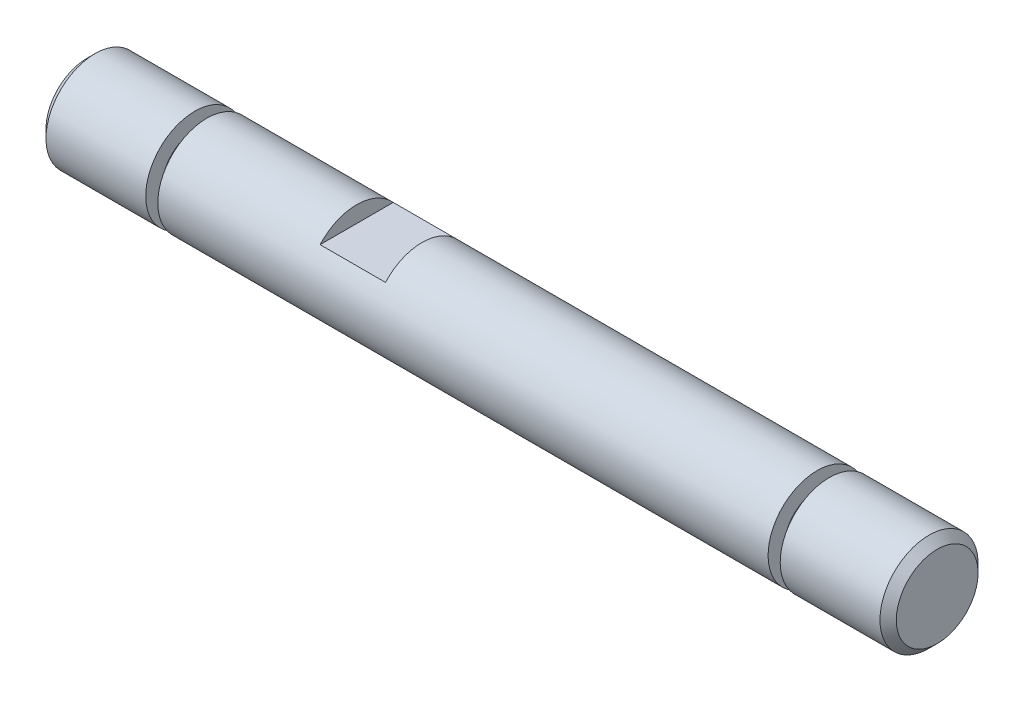
ISO-10303-21;
HEADER;
FILE_DESCRIPTION(('STEP AP214'),'2;1');
FILE_NAME('part.step','',(''),(''),'','','');
FILE_SCHEMA(('AUTOMOTIVE_DESIGN { 1 0 10303 214 1 1 1 1 }'));
ENDSEC;
DATA;
#1=APPLICATION_CONTEXT('core data for automotive mechanical design processes');
#2=APPLICATION_PROTOCOL_DEFINITION('international standard','automotive_design',2000,#1);
#3=PRODUCT_CONTEXT('',#1,'mechanical');
#4=PRODUCT('Part','Part','',(#3));
#5=PRODUCT_RELATED_PRODUCT_CATEGORY('part','',(#4));
#6=PRODUCT_DEFINITION_FORMATION('','',#4);
#7=PRODUCT_DEFINITION_CONTEXT('part definition',#1,'design');
#8=PRODUCT_DEFINITION('design','',#6,#7);
#9=PRODUCT_DEFINITION_SHAPE('','',#8);
#10=(LENGTH_UNIT() NAMED_UNIT(*) SI_UNIT(.MILLI.,.METRE.));
#11=(NAMED_UNIT(*) PLANE_ANGLE_UNIT() SI_UNIT($,.RADIAN.));
#12=(NAMED_UNIT(*) SI_UNIT($,.STERADIAN.) SOLID_ANGLE_UNIT());
#13=UNCERTAINTY_MEASURE_WITH_UNIT(LENGTH_MEASURE(1.E-05),#10,'distance_accuracy_value','');
#14=(GEOMETRIC_REPRESENTATION_CONTEXT(3) GLOBAL_UNCERTAINTY_ASSIGNED_CONTEXT((#13)) GLOBAL_UNIT_ASSIGNED_CONTEXT((#10,
#11,#12)) REPRESENTATION_CONTEXT('',''));
#15=CARTESIAN_POINT('',(0.,0.,0.));
#16=DIRECTION('',(0.,0.,1.));
#17=DIRECTION('',(1.,0.,0.));
#18=AXIS2_PLACEMENT_3D('',#15,#16,#17);
#19=CARTESIAN_POINT('',(0.,0.,0.));
#20=DIRECTION('',(-1.,0.,0.));
#21=DIRECTION('',(0.,0.,1.));
#22=AXIS2_PLACEMENT_3D('',#19,#20,#21);
#23=CYLINDRICAL_SURFACE('',#22,3.);
#24=CARTESIAN_POINT('',(18.66,0.,0.));
#25=DIRECTION('',(1.,0.,0.));
#26=DIRECTION('',(0.,1.,0.));
#27=AXIS2_PLACEMENT_3D('',#24,#25,#26);
#28=CIRCLE('',#27,3.);
#29=CARTESIAN_POINT('',(18.66,3.,0.));
#30=VERTEX_POINT('',#29);
#31=EDGE_CURVE('E98',#30,#30,#28,.T.);
#32=ORIENTED_EDGE('',*,*,#31,.F.);
#33=EDGE_LOOP('',(#32));
#34=FACE_BOUND('',#33,.T.);
#35=CARTESIAN_POINT('',(-5.49999999999999,0.,0.));
#36=DIRECTION('',(-1.,0.,0.));
#37=DIRECTION('',(0.,-1.,0.));
#38=AXIS2_PLACEMENT_3D('',#35,#36,#37);
#39=CIRCLE('',#38,3.);
#40=CARTESIAN_POINT('',(-5.5,2.00000000000001,2.23606797749978));
#41=VERTEX_POINT('',#40);
#42=CARTESIAN_POINT('',(-5.5,2.00000000000001,-2.23606797749978));
#43=VERTEX_POINT('',#42);
#44=EDGE_CURVE('E65',#41,#43,#39,.T.);
#45=ORIENTED_EDGE('',*,*,#44,.F.);
#46=DIRECTION('',(-1.,0.,0.));
#47=VECTOR('',#46,1.);
#48=CARTESIAN_POINT('',(0.,2.00000000000001,2.23606797749978));
#49=LINE('',#48,#47);
#50=CARTESIAN_POINT('',(-9.5,2.00000000000001,2.23606797749978));
#51=VERTEX_POINT('',#50);
#52=EDGE_CURVE('E11',#41,#51,#49,.T.);
#53=ORIENTED_EDGE('',*,*,#52,.T.);
#54=CARTESIAN_POINT('',(-9.5,0.,0.));
#55=DIRECTION('',(-1.,0.,0.));
#56=DIRECTION('',(0.,0.,1.));
#57=AXIS2_PLACEMENT_3D('',#54,#55,#56);
#58=CIRCLE('',#57,3.);
#59=CARTESIAN_POINT('',(-9.5,2.00000000000001,-2.23606797749978));
#60=VERTEX_POINT('',#59);
#61=EDGE_CURVE('E41',#51,#60,#58,.T.);
#62=ORIENTED_EDGE('',*,*,#61,.T.);
#63=DIRECTION('',(-1.,0.,0.));
#64=VECTOR('',#63,1.);
#65=CARTESIAN_POINT('',(0.,2.00000000000001,-2.23606797749978));
#66=LINE('',#65,#64);
#67=EDGE_CURVE('E70',#60,#43,#66,.F.);
#68=ORIENTED_EDGE('',*,*,#67,.T.);
#69=EDGE_LOOP('',(#45,#53,#62,#68));
#70=FACE_BOUND('',#69,.T.);
#71=CARTESIAN_POINT('',(-18.66,0.,0.));
#72=DIRECTION('',(1.,0.,0.));
#73=DIRECTION('',(0.,1.,0.));
#74=AXIS2_PLACEMENT_3D('',#71,#72,#73);
#75=CIRCLE('',#74,3.);
#76=CARTESIAN_POINT('',(-18.66,3.,0.));
#77=VERTEX_POINT('',#76);
#78=EDGE_CURVE('E92',#77,#77,#75,.T.);
#79=ORIENTED_EDGE('',*,*,#78,.T.);
#80=EDGE_LOOP('',(#79));
#81=FACE_BOUND('',#80,.T.);
#82=ADVANCED_FACE('F33',(#34,#70,#81),#23,.T.);
#83=CARTESIAN_POINT('',(-19.4,0.,0.));
#84=DIRECTION('',(1.,0.,0.));
#85=DIRECTION('',(0.,1.,0.));
#86=AXIS2_PLACEMENT_3D('',#83,#84,#85);
#87=CIRCLE('',#86,3.);
#88=CARTESIAN_POINT('',(-19.4,3.,0.));
#89=VERTEX_POINT('',#88);
#90=EDGE_CURVE('E95',#89,#89,#87,.T.);
#91=ORIENTED_EDGE('',*,*,#90,.F.);
#92=EDGE_LOOP('',(#91));
#93=FACE_BOUND('',#92,.T.);
#94=CARTESIAN_POINT('',(-25.5,0.,0.));
#95=DIRECTION('',(1.,0.,0.));
#96=DIRECTION('',(0.,0.,-1.));
#97=AXIS2_PLACEMENT_3D('',#94,#95,#96);
#98=CIRCLE('',#97,3.);
#99=CARTESIAN_POINT('',(-25.5,0.,-3.));
#100=VERTEX_POINT('',#99);
#101=EDGE_CURVE('E77',#100,#100,#98,.T.);
#102=ORIENTED_EDGE('',*,*,#101,.T.);
#103=EDGE_LOOP('',(#102));
#104=FACE_BOUND('',#103,.T.);
#105=ADVANCED_FACE('F134',(#93,#104),#23,.T.);
#106=CARTESIAN_POINT('',(-26.,0.,0.));
#107=DIRECTION('',(1.,0.,0.));
#108=DIRECTION('',(0.,0.,-1.));
#109=AXIS2_PLACEMENT_3D('',#106,#107,#108);
#110=PLANE('',#109);
#111=CARTESIAN_POINT('',(-26.,0.,0.));
#112=DIRECTION('',(1.,0.,0.));
#113=DIRECTION('',(0.,0.,-1.));
#114=AXIS2_PLACEMENT_3D('',#111,#112,#113);
#115=CIRCLE('',#114,2.49999999999999);
#116=CARTESIAN_POINT('',(-26.,0.,-2.49999999999999));
#117=VERTEX_POINT('',#116);
#118=EDGE_CURVE('E67',#117,#117,#115,.F.);
#119=ORIENTED_EDGE('',*,*,#118,.T.);
#120=EDGE_LOOP('',(#119));
#121=FACE_BOUND('',#120,.T.);
#122=ADVANCED_FACE('F139',(#121),#110,.F.);
#123=CARTESIAN_POINT('',(-26.,0.,0.));
#124=DIRECTION('',(1.,0.,0.));
#125=DIRECTION('',(0.,0.,-1.));
#126=AXIS2_PLACEMENT_3D('',#123,#124,#125);
#127=CONICAL_SURFACE('',#126,2.49999999999999,0.785398163397446);
#128=ORIENTED_EDGE('',*,*,#101,.F.);
#129=EDGE_LOOP('',(#128));
#130=FACE_BOUND('',#129,.T.);
#131=ORIENTED_EDGE('',*,*,#118,.F.);
#132=EDGE_LOOP('',(#131));
#133=FACE_BOUND('',#132,.T.);
#134=ADVANCED_FACE('F170',(#130,#133),#127,.T.);
#135=CARTESIAN_POINT('',(-19.4,3.,0.));
#136=DIRECTION('',(-1.,0.,0.));
#137=DIRECTION('',(0.,-1.,0.));
#138=AXIS2_PLACEMENT_3D('',#135,#136,#137);
#139=PLANE('',#138);
#140=CARTESIAN_POINT('',(-19.4,0.,0.));
#141=DIRECTION('',(1.,0.,0.));
#142=DIRECTION('',(0.,1.,0.));
#143=AXIS2_PLACEMENT_3D('',#140,#141,#142);
#144=CIRCLE('',#143,2.);
#145=CARTESIAN_POINT('',(-19.4,2.,0.));
#146=VERTEX_POINT('',#145);
#147=EDGE_CURVE('E85',#146,#146,#144,.T.);
#148=ORIENTED_EDGE('',*,*,#147,.F.);
#149=EDGE_LOOP('',(#148));
#150=FACE_BOUND('',#149,.T.);
#151=ORIENTED_EDGE('',*,*,#90,.T.);
#152=EDGE_LOOP('',(#151));
#153=FACE_BOUND('',#152,.T.);
#154=ADVANCED_FACE('F166',(#150,#153),#139,.F.);
#155=CARTESIAN_POINT('',(0.,0.,0.));
#156=DIRECTION('',(1.,0.,0.));
#157=DIRECTION('',(0.,1.,0.));
#158=AXIS2_PLACEMENT_3D('',#155,#156,#157);
#159=CYLINDRICAL_SURFACE('',#158,2.);
#160=CARTESIAN_POINT('',(-18.66,0.,0.));
#161=DIRECTION('',(1.,0.,0.));
#162=DIRECTION('',(0.,1.,0.));
#163=AXIS2_PLACEMENT_3D('',#160,#161,#162);
#164=CIRCLE('',#163,2.);
#165=CARTESIAN_POINT('',(-18.66,2.,0.));
#166=VERTEX_POINT('',#165);
#167=EDGE_CURVE('E89',#166,#166,#164,.T.);
#168=ORIENTED_EDGE('',*,*,#167,.F.);
#169=EDGE_LOOP('',(#168));
#170=FACE_BOUND('',#169,.T.);
#171=ORIENTED_EDGE('',*,*,#147,.T.);
#172=EDGE_LOOP('',(#171));
#173=FACE_BOUND('',#172,.T.);
#174=ADVANCED_FACE('F169',(#170,#173),#159,.T.);
#175=CARTESIAN_POINT('',(-18.66,3.,0.));
#176=DIRECTION('',(1.,0.,0.));
#177=DIRECTION('',(0.,1.,0.));
#178=AXIS2_PLACEMENT_3D('',#175,#176,#177);
#179=PLANE('',#178);
#180=ORIENTED_EDGE('',*,*,#78,.F.);
#181=EDGE_LOOP('',(#180));
#182=FACE_BOUND('',#181,.T.);
#183=ORIENTED_EDGE('',*,*,#167,.T.);
#184=EDGE_LOOP('',(#183));
#185=FACE_BOUND('',#184,.T.);
#186=ADVANCED_FACE('F161',(#182,#185),#179,.F.);
#187=CARTESIAN_POINT('',(-9.5,4.00000000000001,-3.));
#188=DIRECTION('',(-1.,0.,0.));
#189=DIRECTION('',(0.,0.,1.));
#190=AXIS2_PLACEMENT_3D('',#187,#188,#189);
#191=PLANE('',#190);
#192=DIRECTION('',(0.,0.,1.));
#193=VECTOR('',#192,1.);
#194=CARTESIAN_POINT('',(-9.5,2.00000000000001,-3.));
#195=LINE('',#194,#193);
#196=EDGE_CURVE('E60',#60,#51,#195,.T.);
#197=ORIENTED_EDGE('',*,*,#196,.F.);
#198=ORIENTED_EDGE('',*,*,#61,.F.);
#199=EDGE_LOOP('',(#197,#198));
#200=FACE_BOUND('',#199,.T.);
#201=ADVANCED_FACE('F158',(#200),#191,.F.);
#202=CARTESIAN_POINT('',(-9.5,2.00000000000001,-3.));
#203=DIRECTION('',(0.,-1.,0.));
#204=DIRECTION('',(0.,0.,-1.));
#205=AXIS2_PLACEMENT_3D('',#202,#203,#204);
#206=PLANE('',#205);
#207=DIRECTION('',(0.,0.,1.));
#208=VECTOR('',#207,1.);
#209=CARTESIAN_POINT('',(-5.5,2.00000000000001,-3.));
#210=LINE('',#209,#208);
#211=EDGE_CURVE('E48',#43,#41,#210,.T.);
#212=ORIENTED_EDGE('',*,*,#211,.F.);
#213=ORIENTED_EDGE('',*,*,#67,.F.);
#214=ORIENTED_EDGE('',*,*,#196,.T.);
#215=ORIENTED_EDGE('',*,*,#52,.F.);
#216=EDGE_LOOP('',(#212,#213,#214,#215));
#217=FACE_BOUND('',#216,.T.);
#218=ADVANCED_FACE('F59',(#217),#206,.F.);
#219=CARTESIAN_POINT('',(-5.5,4.00000000000001,-3.));
#220=DIRECTION('',(-1.,0.,0.));
#221=DIRECTION('',(0.,-1.,0.));
#222=AXIS2_PLACEMENT_3D('',#219,#220,#221);
#223=PLANE('',#222);
#224=ORIENTED_EDGE('',*,*,#44,.T.);
#225=ORIENTED_EDGE('',*,*,#211,.T.);
#226=EDGE_LOOP('',(#224,#225));
#227=FACE_BOUND('',#226,.T.);
#228=ADVANCED_FACE('F64',(#227),#223,.T.);
#229=CARTESIAN_POINT('',(18.66,3.,0.));
#230=DIRECTION('',(-1.,0.,0.));
#231=DIRECTION('',(0.,-1.,0.));
#232=AXIS2_PLACEMENT_3D('',#229,#230,#231);
#233=PLANE('',#232);
#234=CARTESIAN_POINT('',(18.66,0.,0.));
#235=DIRECTION('',(1.,0.,0.));
#236=DIRECTION('',(0.,1.,0.));
#237=AXIS2_PLACEMENT_3D('',#234,#235,#236);
#238=CIRCLE('',#237,2.);
#239=CARTESIAN_POINT('',(18.66,2.,0.));
#240=VERTEX_POINT('',#239);
#241=EDGE_CURVE('E101',#240,#240,#238,.T.);
#242=ORIENTED_EDGE('',*,*,#241,.F.);
#243=EDGE_LOOP('',(#242));
#244=FACE_BOUND('',#243,.T.);
#245=ORIENTED_EDGE('',*,*,#31,.T.);
#246=EDGE_LOOP('',(#245));
#247=FACE_BOUND('',#246,.T.);
#248=ADVANCED_FACE('F124',(#244,#247),#233,.F.);
#249=CARTESIAN_POINT('',(0.,0.,0.));
#250=DIRECTION('',(1.,0.,0.));
#251=DIRECTION('',(0.,1.,0.));
#252=AXIS2_PLACEMENT_3D('',#249,#250,#251);
#253=CYLINDRICAL_SURFACE('',#252,2.);
#254=CARTESIAN_POINT('',(19.4,0.,0.));
#255=DIRECTION('',(1.,0.,0.));
#256=DIRECTION('',(0.,1.,0.));
#257=AXIS2_PLACEMENT_3D('',#254,#255,#256);
#258=CIRCLE('',#257,2.);
#259=CARTESIAN_POINT('',(19.4,2.,0.));
#260=VERTEX_POINT('',#259);
#261=EDGE_CURVE('E104',#260,#260,#258,.T.);
#262=ORIENTED_EDGE('',*,*,#261,.F.);
#263=EDGE_LOOP('',(#262));
#264=FACE_BOUND('',#263,.T.);
#265=ORIENTED_EDGE('',*,*,#241,.T.);
#266=EDGE_LOOP('',(#265));
#267=FACE_BOUND('',#266,.T.);
#268=ADVANCED_FACE('F118',(#264,#267),#253,.T.);
#269=CARTESIAN_POINT('',(19.4,3.,0.));
#270=DIRECTION('',(1.,0.,0.));
#271=DIRECTION('',(0.,1.,0.));
#272=AXIS2_PLACEMENT_3D('',#269,#270,#271);
#273=PLANE('',#272);
#274=CARTESIAN_POINT('',(19.4,0.,0.));
#275=DIRECTION('',(1.,0.,0.));
#276=DIRECTION('',(0.,1.,0.));
#277=AXIS2_PLACEMENT_3D('',#274,#275,#276);
#278=CIRCLE('',#277,3.);
#279=CARTESIAN_POINT('',(19.4,3.,0.));
#280=VERTEX_POINT('',#279);
#281=EDGE_CURVE('E107',#280,#280,#278,.T.);
#282=ORIENTED_EDGE('',*,*,#281,.F.);
#283=EDGE_LOOP('',(#282));
#284=FACE_BOUND('',#283,.T.);
#285=ORIENTED_EDGE('',*,*,#261,.T.);
#286=EDGE_LOOP('',(#285));
#287=FACE_BOUND('',#286,.T.);
#288=ADVANCED_FACE('F114',(#284,#287),#273,.F.);
#289=CARTESIAN_POINT('',(26.,0.,0.));
#290=DIRECTION('',(-1.,0.,0.));
#291=DIRECTION('',(0.,0.,1.));
#292=AXIS2_PLACEMENT_3D('',#289,#290,#291);
#293=PLANE('',#292);
#294=CARTESIAN_POINT('',(26.,0.,0.));
#295=DIRECTION('',(-1.,0.,0.));
#296=DIRECTION('',(0.,0.,1.));
#297=AXIS2_PLACEMENT_3D('',#294,#295,#296);
#298=CIRCLE('',#297,2.50000000000002);
#299=CARTESIAN_POINT('',(26.,0.,2.50000000000002));
#300=VERTEX_POINT('',#299);
#301=EDGE_CURVE('E72',#300,#300,#298,.F.);
#302=ORIENTED_EDGE('',*,*,#301,.T.);
#303=EDGE_LOOP('',(#302));
#304=FACE_BOUND('',#303,.T.);
#305=ADVANCED_FACE('F117',(#304),#293,.F.);
#306=CARTESIAN_POINT('',(25.5,0.,0.));
#307=DIRECTION('',(-1.,0.,0.));
#308=DIRECTION('',(0.,0.,1.));
#309=AXIS2_PLACEMENT_3D('',#306,#307,#308);
#310=CONICAL_SURFACE('',#309,3.,0.785398163397453);
#311=ORIENTED_EDGE('',*,*,#301,.F.);
#312=EDGE_LOOP('',(#311));
#313=FACE_BOUND('',#312,.T.);
#314=CARTESIAN_POINT('',(25.5,0.,0.));
#315=DIRECTION('',(-1.,0.,0.));
#316=DIRECTION('',(0.,0.,1.));
#317=AXIS2_PLACEMENT_3D('',#314,#315,#316);
#318=CIRCLE('',#317,3.);
#319=CARTESIAN_POINT('',(25.5,0.,3.));
#320=VERTEX_POINT('',#319);
#321=EDGE_CURVE('E80',#320,#320,#318,.T.);
#322=ORIENTED_EDGE('',*,*,#321,.F.);
#323=EDGE_LOOP('',(#322));
#324=FACE_BOUND('',#323,.T.);
#325=ADVANCED_FACE('F35',(#313,#324),#310,.T.);
#326=ORIENTED_EDGE('',*,*,#281,.T.);
#327=EDGE_LOOP('',(#326));
#328=FACE_BOUND('',#327,.T.);
#329=ORIENTED_EDGE('',*,*,#321,.T.);
#330=EDGE_LOOP('',(#329));
#331=FACE_BOUND('',#330,.T.);
#332=ADVANCED_FACE('F111',(#328,#331),#23,.T.);
#333=CLOSED_SHELL('',(#82,#105,#122,#134,#154,#174,#186,#201,#218,#228,#248,#268,#288,#305,#325,#332));
#334=MANIFOLD_SOLID_BREP('B2',#333);
#335=ADVANCED_BREP_SHAPE_REPRESENTATION('',(#18,#334),#14);
#336=SHAPE_DEFINITION_REPRESENTATION(#9,#335);
ENDSEC;
END-ISO-10303-21;
